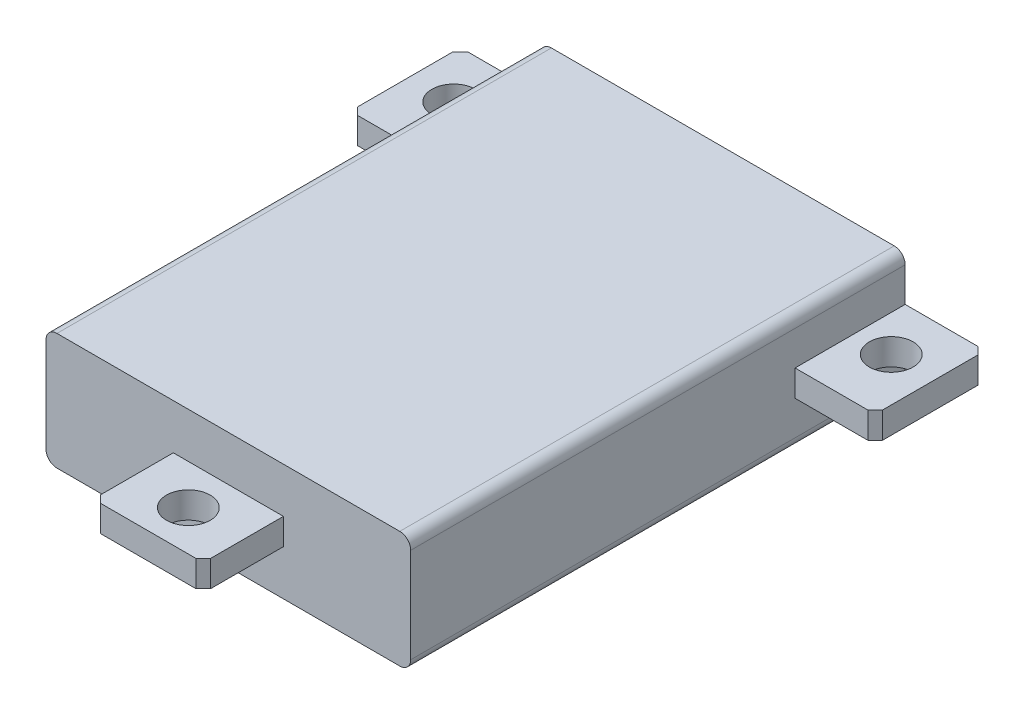
ISO-10303-21;
HEADER;
FILE_DESCRIPTION(('STEP AP214'),'2;1');
FILE_NAME('part.step','',(''),(''),'','','');
FILE_SCHEMA(('AUTOMOTIVE_DESIGN { 1 0 10303 214 1 1 1 1 }'));
ENDSEC;
DATA;
#1=APPLICATION_CONTEXT('core data for automotive mechanical design processes');
#2=APPLICATION_PROTOCOL_DEFINITION('international standard','automotive_design',2000,#1);
#3=PRODUCT_CONTEXT('',#1,'mechanical');
#4=PRODUCT('Part','Part','',(#3));
#5=PRODUCT_RELATED_PRODUCT_CATEGORY('part','',(#4));
#6=PRODUCT_DEFINITION_FORMATION('','',#4);
#7=PRODUCT_DEFINITION_CONTEXT('part definition',#1,'design');
#8=PRODUCT_DEFINITION('design','',#6,#7);
#9=PRODUCT_DEFINITION_SHAPE('','',#8);
#10=(LENGTH_UNIT() NAMED_UNIT(*) SI_UNIT(.MILLI.,.METRE.));
#11=(NAMED_UNIT(*) PLANE_ANGLE_UNIT() SI_UNIT($,.RADIAN.));
#12=(NAMED_UNIT(*) SI_UNIT($,.STERADIAN.) SOLID_ANGLE_UNIT());
#13=UNCERTAINTY_MEASURE_WITH_UNIT(LENGTH_MEASURE(1.E-05),#10,'distance_accuracy_value','');
#14=(GEOMETRIC_REPRESENTATION_CONTEXT(3) GLOBAL_UNCERTAINTY_ASSIGNED_CONTEXT((#13)) GLOBAL_UNIT_ASSIGNED_CONTEXT((#10,
#11,#12)) REPRESENTATION_CONTEXT('',''));
#15=CARTESIAN_POINT('',(0.,0.,0.));
#16=DIRECTION('',(0.,0.,1.));
#17=DIRECTION('',(1.,0.,0.));
#18=AXIS2_PLACEMENT_3D('',#15,#16,#17);
#19=CARTESIAN_POINT('',(-12.505,8.,16.9525));
#20=DIRECTION('',(1.,0.,0.));
#21=DIRECTION('',(0.,0.,-1.));
#22=AXIS2_PLACEMENT_3D('',#19,#20,#21);
#23=PLANE('',#22);
#24=DIRECTION('',(0.,-1.,0.));
#25=VECTOR('',#24,1.);
#26=CARTESIAN_POINT('',(-12.505,8.,-16.9525));
#27=LINE('',#26,#25);
#28=CARTESIAN_POINT('',(-12.505,3.1,-16.9525));
#29=VERTEX_POINT('',#28);
#30=CARTESIAN_POINT('',(-12.505,0.75,-16.9525));
#31=VERTEX_POINT('',#30);
#32=EDGE_CURVE('E350',#29,#31,#27,.T.);
#33=ORIENTED_EDGE('',*,*,#32,.T.);
#34=DIRECTION('',(0.,0.,1.));
#35=VECTOR('',#34,1.);
#36=CARTESIAN_POINT('',(-12.505,0.75,16.9525));
#37=LINE('',#36,#35);
#38=CARTESIAN_POINT('',(-12.505,0.75,16.9525));
#39=VERTEX_POINT('',#38);
#40=EDGE_CURVE('E416',#31,#39,#37,.T.);
#41=ORIENTED_EDGE('',*,*,#40,.T.);
#42=DIRECTION('',(0.,-1.,0.));
#43=VECTOR('',#42,1.);
#44=CARTESIAN_POINT('',(-12.505,8.,16.9525));
#45=LINE('',#44,#43);
#46=CARTESIAN_POINT('',(-12.505,7.25,16.9525));
#47=VERTEX_POINT('',#46);
#48=EDGE_CURVE('E346',#47,#39,#45,.T.);
#49=ORIENTED_EDGE('',*,*,#48,.F.);
#50=DIRECTION('',(0.,0.,1.));
#51=VECTOR('',#50,1.);
#52=CARTESIAN_POINT('',(-12.505,7.25,16.9525));
#53=LINE('',#52,#51);
#54=CARTESIAN_POINT('',(-12.505,7.25,-16.9525));
#55=VERTEX_POINT('',#54);
#56=EDGE_CURVE('E413',#47,#55,#53,.F.);
#57=ORIENTED_EDGE('',*,*,#56,.T.);
#58=CARTESIAN_POINT('',(-12.505,4.9,-16.9525));
#59=VERTEX_POINT('',#58);
#60=EDGE_CURVE('E351',#55,#59,#27,.T.);
#61=ORIENTED_EDGE('',*,*,#60,.T.);
#62=DIRECTION('',(0.,0.,-1.));
#63=VECTOR('',#62,1.);
#64=CARTESIAN_POINT('',(-12.505,4.9,-16.9525));
#65=LINE('',#64,#63);
#66=CARTESIAN_POINT('',(-12.505,4.9,-9.4025));
#67=VERTEX_POINT('',#66);
#68=EDGE_CURVE('E265',#67,#59,#65,.T.);
#69=ORIENTED_EDGE('',*,*,#68,.F.);
#70=DIRECTION('',(0.,1.,0.));
#71=VECTOR('',#70,1.);
#72=CARTESIAN_POINT('',(-12.505,3.1,-9.4025));
#73=LINE('',#72,#71);
#74=CARTESIAN_POINT('',(-12.505,3.1,-9.4025));
#75=VERTEX_POINT('',#74);
#76=EDGE_CURVE('E273',#75,#67,#73,.T.);
#77=ORIENTED_EDGE('',*,*,#76,.F.);
#78=DIRECTION('',(0.,0.,1.));
#79=VECTOR('',#78,1.);
#80=CARTESIAN_POINT('',(-12.505,3.1,-16.9525));
#81=LINE('',#80,#79);
#82=EDGE_CURVE('E259',#29,#75,#81,.T.);
#83=ORIENTED_EDGE('',*,*,#82,.F.);
#84=EDGE_LOOP('',(#33,#41,#49,#57,#61,#69,#77,#83));
#85=FACE_BOUND('',#84,.T.);
#86=ADVANCED_FACE('F40',(#85),#23,.F.);
#87=CARTESIAN_POINT('',(-12.505,8.,16.9525));
#88=DIRECTION('',(0.,0.,-1.));
#89=DIRECTION('',(-1.,0.,0.));
#90=AXIS2_PLACEMENT_3D('',#87,#88,#89);
#91=PLANE('',#90);
#92=DIRECTION('',(1.,0.,0.));
#93=VECTOR('',#92,1.);
#94=CARTESIAN_POINT('',(-12.505,0.,16.9525));
#95=LINE('',#94,#93);
#96=CARTESIAN_POINT('',(-11.755,0.,16.9525));
#97=VERTEX_POINT('',#96);
#98=CARTESIAN_POINT('',(11.755,0.,16.9525));
#99=VERTEX_POINT('',#98);
#100=EDGE_CURVE('E333',#97,#99,#95,.T.);
#101=ORIENTED_EDGE('',*,*,#100,.T.);
#102=CARTESIAN_POINT('',(11.755,0.75,16.9525));
#103=DIRECTION('',(0.,0.,-1.));
#104=DIRECTION('',(-1.,0.,0.));
#105=AXIS2_PLACEMENT_3D('',#102,#103,#104);
#106=CIRCLE('',#105,0.75);
#107=CARTESIAN_POINT('',(12.505,0.75,16.9525));
#108=VERTEX_POINT('',#107);
#109=EDGE_CURVE('E402',#99,#108,#106,.F.);
#110=ORIENTED_EDGE('',*,*,#109,.T.);
#111=DIRECTION('',(0.,-1.,0.));
#112=VECTOR('',#111,1.);
#113=CARTESIAN_POINT('',(12.505,8.,16.9525));
#114=LINE('',#113,#112);
#115=CARTESIAN_POINT('',(12.505,7.25,16.9525));
#116=VERTEX_POINT('',#115);
#117=EDGE_CURVE('E337',#116,#108,#114,.T.);
#118=ORIENTED_EDGE('',*,*,#117,.F.);
#119=CARTESIAN_POINT('',(11.755,7.25,16.9525));
#120=DIRECTION('',(0.,0.,-1.));
#121=DIRECTION('',(-1.,0.,0.));
#122=AXIS2_PLACEMENT_3D('',#119,#120,#121);
#123=CIRCLE('',#122,0.75);
#124=CARTESIAN_POINT('',(11.755,8.,16.9525));
#125=VERTEX_POINT('',#124);
#126=EDGE_CURVE('E399',#116,#125,#123,.F.);
#127=ORIENTED_EDGE('',*,*,#126,.T.);
#128=DIRECTION('',(1.,0.,0.));
#129=VECTOR('',#128,1.);
#130=CARTESIAN_POINT('',(-12.505,8.,16.9525));
#131=LINE('',#130,#129);
#132=CARTESIAN_POINT('',(-11.755,8.,16.9525));
#133=VERTEX_POINT('',#132);
#134=EDGE_CURVE('E332',#133,#125,#131,.T.);
#135=ORIENTED_EDGE('',*,*,#134,.F.);
#136=CARTESIAN_POINT('',(-11.755,7.25,16.9525));
#137=DIRECTION('',(0.,0.,-1.));
#138=DIRECTION('',(-1.,0.,0.));
#139=AXIS2_PLACEMENT_3D('',#136,#137,#138);
#140=CIRCLE('',#139,0.75);
#141=EDGE_CURVE('E393',#133,#47,#140,.F.);
#142=ORIENTED_EDGE('',*,*,#141,.T.);
#143=ORIENTED_EDGE('',*,*,#48,.T.);
#144=CARTESIAN_POINT('',(-11.755,0.75,16.9525));
#145=DIRECTION('',(0.,0.,-1.));
#146=DIRECTION('',(-1.,0.,0.));
#147=AXIS2_PLACEMENT_3D('',#144,#145,#146);
#148=CIRCLE('',#147,0.75);
#149=EDGE_CURVE('E396',#39,#97,#148,.F.);
#150=ORIENTED_EDGE('',*,*,#149,.T.);
#151=EDGE_LOOP('',(#101,#110,#118,#127,#135,#142,#143,#150));
#152=FACE_BOUND('',#151,.T.);
#153=DIRECTION('',(0.,1.,0.));
#154=VECTOR('',#153,1.);
#155=CARTESIAN_POINT('',(3.775,3.1,16.9525));
#156=LINE('',#155,#154);
#157=CARTESIAN_POINT('',(3.775,3.1,16.9525));
#158=VERTEX_POINT('',#157);
#159=CARTESIAN_POINT('',(3.775,4.9,16.9525));
#160=VERTEX_POINT('',#159);
#161=EDGE_CURVE('E291',#158,#160,#156,.T.);
#162=ORIENTED_EDGE('',*,*,#161,.F.);
#163=DIRECTION('',(1.,0.,0.));
#164=VECTOR('',#163,1.);
#165=CARTESIAN_POINT('',(-3.775,3.1,16.9525));
#166=LINE('',#165,#164);
#167=CARTESIAN_POINT('',(-3.775,3.1,16.9525));
#168=VERTEX_POINT('',#167);
#169=EDGE_CURVE('E297',#168,#158,#166,.T.);
#170=ORIENTED_EDGE('',*,*,#169,.F.);
#171=DIRECTION('',(0.,-1.,0.));
#172=VECTOR('',#171,1.);
#173=CARTESIAN_POINT('',(-3.775,3.1,16.9525));
#174=LINE('',#173,#172);
#175=CARTESIAN_POINT('',(-3.775,4.9,16.9525));
#176=VERTEX_POINT('',#175);
#177=EDGE_CURVE('E309',#176,#168,#174,.T.);
#178=ORIENTED_EDGE('',*,*,#177,.F.);
#179=DIRECTION('',(-1.,0.,0.));
#180=VECTOR('',#179,1.);
#181=CARTESIAN_POINT('',(-3.775,4.9,16.9525));
#182=LINE('',#181,#180);
#183=EDGE_CURVE('E305',#160,#176,#182,.T.);
#184=ORIENTED_EDGE('',*,*,#183,.F.);
#185=EDGE_LOOP('',(#162,#170,#178,#184));
#186=FACE_BOUND('',#185,.T.);
#187=ADVANCED_FACE('F578',(#152,#186),#91,.F.);
#188=CARTESIAN_POINT('',(12.505,8.,16.9525));
#189=DIRECTION('',(-1.,0.,0.));
#190=DIRECTION('',(0.,0.,1.));
#191=AXIS2_PLACEMENT_3D('',#188,#189,#190);
#192=PLANE('',#191);
#193=ORIENTED_EDGE('',*,*,#117,.T.);
#194=DIRECTION('',(0.,0.,-1.));
#195=VECTOR('',#194,1.);
#196=CARTESIAN_POINT('',(12.505,0.75,-16.9525));
#197=LINE('',#196,#195);
#198=CARTESIAN_POINT('',(12.505,0.75,-16.9525));
#199=VERTEX_POINT('',#198);
#200=EDGE_CURVE('E371',#108,#199,#197,.T.);
#201=ORIENTED_EDGE('',*,*,#200,.T.);
#202=DIRECTION('',(0.,-1.,0.));
#203=VECTOR('',#202,1.);
#204=CARTESIAN_POINT('',(12.505,8.,-16.9525));
#205=LINE('',#204,#203);
#206=CARTESIAN_POINT('',(12.505,3.1,-16.9525));
#207=VERTEX_POINT('',#206);
#208=EDGE_CURVE('E355',#207,#199,#205,.T.);
#209=ORIENTED_EDGE('',*,*,#208,.F.);
#210=DIRECTION('',(0.,0.,1.));
#211=VECTOR('',#210,1.);
#212=CARTESIAN_POINT('',(12.505,3.1,-16.9525));
#213=LINE('',#212,#211);
#214=CARTESIAN_POINT('',(12.505,3.1,-9.4025));
#215=VERTEX_POINT('',#214);
#216=EDGE_CURVE('E243',#207,#215,#213,.T.);
#217=ORIENTED_EDGE('',*,*,#216,.T.);
#218=DIRECTION('',(0.,1.,0.));
#219=VECTOR('',#218,1.);
#220=CARTESIAN_POINT('',(12.505,3.1,-9.4025));
#221=LINE('',#220,#219);
#222=CARTESIAN_POINT('',(12.505,4.9,-9.4025));
#223=VERTEX_POINT('',#222);
#224=EDGE_CURVE('E220',#215,#223,#221,.T.);
#225=ORIENTED_EDGE('',*,*,#224,.T.);
#226=DIRECTION('',(0.,0.,-1.));
#227=VECTOR('',#226,1.);
#228=CARTESIAN_POINT('',(12.505,4.9,-16.9525));
#229=LINE('',#228,#227);
#230=CARTESIAN_POINT('',(12.505,4.9,-16.9525));
#231=VERTEX_POINT('',#230);
#232=EDGE_CURVE('E230',#223,#231,#229,.T.);
#233=ORIENTED_EDGE('',*,*,#232,.T.);
#234=CARTESIAN_POINT('',(12.505,7.25,-16.9525));
#235=VERTEX_POINT('',#234);
#236=EDGE_CURVE('E356',#235,#231,#205,.T.);
#237=ORIENTED_EDGE('',*,*,#236,.F.);
#238=DIRECTION('',(0.,0.,-1.));
#239=VECTOR('',#238,1.);
#240=CARTESIAN_POINT('',(12.505,7.25,16.9525));
#241=LINE('',#240,#239);
#242=EDGE_CURVE('E359',#235,#116,#241,.F.);
#243=ORIENTED_EDGE('',*,*,#242,.T.);
#244=EDGE_LOOP('',(#193,#201,#209,#217,#225,#233,#237,#243));
#245=FACE_BOUND('',#244,.T.);
#246=ADVANCED_FACE('F240',(#245),#192,.F.);
#247=CARTESIAN_POINT('',(-12.505,8.,-16.9525));
#248=DIRECTION('',(0.,0.,1.));
#249=DIRECTION('',(1.,0.,0.));
#250=AXIS2_PLACEMENT_3D('',#247,#248,#249);
#251=PLANE('',#250);
#252=CARTESIAN_POINT('',(6.555,4.,-16.9525));
#253=DIRECTION('',(0.,0.,-1.));
#254=DIRECTION('',(-1.,0.,0.));
#255=AXIS2_PLACEMENT_3D('',#252,#253,#254);
#256=CIRCLE('',#255,1.5);
#257=CARTESIAN_POINT('',(5.055,4.,-16.9525));
#258=VERTEX_POINT('',#257);
#259=EDGE_CURVE('E514',#258,#258,#256,.T.);
#260=ORIENTED_EDGE('',*,*,#259,.F.);
#261=EDGE_LOOP('',(#260));
#262=FACE_BOUND('',#261,.T.);
#263=DIRECTION('',(1.,0.,0.));
#264=VECTOR('',#263,1.);
#265=CARTESIAN_POINT('',(-18.,3.1,-16.9525));
#266=LINE('',#265,#264);
#267=CARTESIAN_POINT('',(-17.5,3.1,-16.9525));
#268=VERTEX_POINT('',#267);
#269=EDGE_CURVE('E288',#268,#29,#266,.T.);
#270=ORIENTED_EDGE('',*,*,#269,.F.);
#271=DIRECTION('',(0.,1.,0.));
#272=VECTOR('',#271,1.);
#273=CARTESIAN_POINT('',(-17.5,8.,-16.9525));
#274=LINE('',#273,#272);
#275=CARTESIAN_POINT('',(-17.5,4.9,-16.9525));
#276=VERTEX_POINT('',#275);
#277=EDGE_CURVE('E438',#268,#276,#274,.T.);
#278=ORIENTED_EDGE('',*,*,#277,.T.);
#279=DIRECTION('',(1.,0.,0.));
#280=VECTOR('',#279,1.);
#281=CARTESIAN_POINT('',(-18.,4.9,-16.9525));
#282=LINE('',#281,#280);
#283=EDGE_CURVE('E269',#276,#59,#282,.T.);
#284=ORIENTED_EDGE('',*,*,#283,.T.);
#285=ORIENTED_EDGE('',*,*,#60,.F.);
#286=CARTESIAN_POINT('',(-11.755,7.25,-16.9525));
#287=DIRECTION('',(0.,0.,1.));
#288=DIRECTION('',(1.,0.,0.));
#289=AXIS2_PLACEMENT_3D('',#286,#287,#288);
#290=CIRCLE('',#289,0.75);
#291=CARTESIAN_POINT('',(-11.755,8.,-16.9525));
#292=VERTEX_POINT('',#291);
#293=EDGE_CURVE('E375',#55,#292,#290,.F.);
#294=ORIENTED_EDGE('',*,*,#293,.T.);
#295=DIRECTION('',(-1.,0.,0.));
#296=VECTOR('',#295,1.);
#297=CARTESIAN_POINT('',(-12.505,8.,-16.9525));
#298=LINE('',#297,#296);
#299=CARTESIAN_POINT('',(11.755,8.,-16.9525));
#300=VERTEX_POINT('',#299);
#301=EDGE_CURVE('E328',#300,#292,#298,.T.);
#302=ORIENTED_EDGE('',*,*,#301,.F.);
#303=CARTESIAN_POINT('',(11.755,7.25,-16.9525));
#304=DIRECTION('',(0.,0.,1.));
#305=DIRECTION('',(1.,0.,0.));
#306=AXIS2_PLACEMENT_3D('',#303,#304,#305);
#307=CIRCLE('',#306,0.75);
#308=EDGE_CURVE('E381',#300,#235,#307,.F.);
#309=ORIENTED_EDGE('',*,*,#308,.T.);
#310=ORIENTED_EDGE('',*,*,#236,.T.);
#311=DIRECTION('',(-1.,0.,0.));
#312=VECTOR('',#311,1.);
#313=CARTESIAN_POINT('',(18.,4.9,-16.9525));
#314=LINE('',#313,#312);
#315=CARTESIAN_POINT('',(17.5,4.9,-16.9525));
#316=VERTEX_POINT('',#315);
#317=EDGE_CURVE('E226',#316,#231,#314,.T.);
#318=ORIENTED_EDGE('',*,*,#317,.F.);
#319=DIRECTION('',(0.,-1.,0.));
#320=VECTOR('',#319,1.);
#321=CARTESIAN_POINT('',(17.5,8.,-16.9525));
#322=LINE('',#321,#320);
#323=CARTESIAN_POINT('',(17.5,3.1,-16.9525));
#324=VERTEX_POINT('',#323);
#325=EDGE_CURVE('E434',#316,#324,#322,.T.);
#326=ORIENTED_EDGE('',*,*,#325,.T.);
#327=DIRECTION('',(-1.,0.,0.));
#328=VECTOR('',#327,1.);
#329=CARTESIAN_POINT('',(18.,3.1,-16.9525));
#330=LINE('',#329,#328);
#331=EDGE_CURVE('E251',#324,#207,#330,.T.);
#332=ORIENTED_EDGE('',*,*,#331,.T.);
#333=ORIENTED_EDGE('',*,*,#208,.T.);
#334=CARTESIAN_POINT('',(11.755,0.75,-16.9525));
#335=DIRECTION('',(0.,0.,1.));
#336=DIRECTION('',(1.,0.,0.));
#337=AXIS2_PLACEMENT_3D('',#334,#335,#336);
#338=CIRCLE('',#337,0.75);
#339=CARTESIAN_POINT('',(11.755,0.,-16.9525));
#340=VERTEX_POINT('',#339);
#341=EDGE_CURVE('E384',#199,#340,#338,.F.);
#342=ORIENTED_EDGE('',*,*,#341,.T.);
#343=DIRECTION('',(-1.,0.,0.));
#344=VECTOR('',#343,1.);
#345=CARTESIAN_POINT('',(-12.505,0.,-16.9525));
#346=LINE('',#345,#344);
#347=CARTESIAN_POINT('',(-11.755,0.,-16.9525));
#348=VERTEX_POINT('',#347);
#349=EDGE_CURVE('E327',#340,#348,#346,.T.);
#350=ORIENTED_EDGE('',*,*,#349,.T.);
#351=CARTESIAN_POINT('',(-11.755,0.75,-16.9525));
#352=DIRECTION('',(0.,0.,1.));
#353=DIRECTION('',(1.,0.,0.));
#354=AXIS2_PLACEMENT_3D('',#351,#352,#353);
#355=CIRCLE('',#354,0.75);
#356=EDGE_CURVE('E378',#348,#31,#355,.F.);
#357=ORIENTED_EDGE('',*,*,#356,.T.);
#358=ORIENTED_EDGE('',*,*,#32,.F.);
#359=EDGE_LOOP('',(#270,#278,#284,#285,#294,#302,#309,#310,#318,#326,#332,#333,#342,#350,#357,#358));
#360=FACE_BOUND('',#359,.T.);
#361=ADVANCED_FACE('F531',(#262,#360),#251,.F.);
#362=CARTESIAN_POINT('',(0.,8.,0.));
#363=DIRECTION('',(0.,-1.,0.));
#364=DIRECTION('',(0.,0.,-1.));
#365=AXIS2_PLACEMENT_3D('',#362,#363,#364);
#366=PLANE('',#365);
#367=ORIENTED_EDGE('',*,*,#134,.T.);
#368=DIRECTION('',(0.,0.,-1.));
#369=VECTOR('',#368,1.);
#370=CARTESIAN_POINT('',(11.755,8.,0.));
#371=LINE('',#370,#369);
#372=EDGE_CURVE('E409',#125,#300,#371,.T.);
#373=ORIENTED_EDGE('',*,*,#372,.T.);
#374=ORIENTED_EDGE('',*,*,#301,.T.);
#375=DIRECTION('',(0.,0.,1.));
#376=VECTOR('',#375,1.);
#377=CARTESIAN_POINT('',(-11.755,8.,0.));
#378=LINE('',#377,#376);
#379=EDGE_CURVE('E405',#292,#133,#378,.T.);
#380=ORIENTED_EDGE('',*,*,#379,.T.);
#381=EDGE_LOOP('',(#367,#373,#374,#380));
#382=FACE_BOUND('',#381,.T.);
#383=ADVANCED_FACE('F534',(#382),#366,.F.);
#384=CARTESIAN_POINT('',(0.,0.,0.));
#385=DIRECTION('',(0.,-1.,0.));
#386=DIRECTION('',(0.,0.,-1.));
#387=AXIS2_PLACEMENT_3D('',#384,#385,#386);
#388=PLANE('',#387);
#389=ORIENTED_EDGE('',*,*,#349,.F.);
#390=DIRECTION('',(0.,0.,-1.));
#391=VECTOR('',#390,1.);
#392=CARTESIAN_POINT('',(11.755,0.,16.9525));
#393=LINE('',#392,#391);
#394=EDGE_CURVE('E390',#340,#99,#393,.F.);
#395=ORIENTED_EDGE('',*,*,#394,.T.);
#396=ORIENTED_EDGE('',*,*,#100,.F.);
#397=DIRECTION('',(0.,0.,1.));
#398=VECTOR('',#397,1.);
#399=CARTESIAN_POINT('',(-11.755,0.,-16.9525));
#400=LINE('',#399,#398);
#401=EDGE_CURVE('E387',#97,#348,#400,.F.);
#402=ORIENTED_EDGE('',*,*,#401,.T.);
#403=EDGE_LOOP('',(#389,#395,#396,#402));
#404=FACE_BOUND('',#403,.T.);
#405=ADVANCED_FACE('F664',(#404),#388,.T.);
#406=CARTESIAN_POINT('',(3.775,3.1,22.4475));
#407=DIRECTION('',(-1.,0.,0.));
#408=DIRECTION('',(0.,0.,1.));
#409=AXIS2_PLACEMENT_3D('',#406,#407,#408);
#410=PLANE('',#409);
#411=DIRECTION('',(0.,0.,-1.));
#412=VECTOR('',#411,1.);
#413=CARTESIAN_POINT('',(3.775,4.9,22.4475));
#414=LINE('',#413,#412);
#415=CARTESIAN_POINT('',(3.775,4.9,21.9475));
#416=VERTEX_POINT('',#415);
#417=EDGE_CURVE('E324',#416,#160,#414,.T.);
#418=ORIENTED_EDGE('',*,*,#417,.F.);
#419=DIRECTION('',(0.,-1.,0.));
#420=VECTOR('',#419,1.);
#421=CARTESIAN_POINT('',(3.775,3.1,21.9475));
#422=LINE('',#421,#420);
#423=CARTESIAN_POINT('',(3.775,3.1,21.9475));
#424=VERTEX_POINT('',#423);
#425=EDGE_CURVE('E473',#416,#424,#422,.T.);
#426=ORIENTED_EDGE('',*,*,#425,.T.);
#427=DIRECTION('',(0.,0.,-1.));
#428=VECTOR('',#427,1.);
#429=CARTESIAN_POINT('',(3.775,3.1,22.4475));
#430=LINE('',#429,#428);
#431=EDGE_CURVE('E301',#424,#158,#430,.T.);
#432=ORIENTED_EDGE('',*,*,#431,.T.);
#433=ORIENTED_EDGE('',*,*,#161,.T.);
#434=EDGE_LOOP('',(#418,#426,#432,#433));
#435=FACE_BOUND('',#434,.T.);
#436=ADVANCED_FACE('F668',(#435),#410,.F.);
#437=CARTESIAN_POINT('',(-3.775,4.9,22.4475));
#438=DIRECTION('',(0.,-1.,0.));
#439=DIRECTION('',(0.,0.,-1.));
#440=AXIS2_PLACEMENT_3D('',#437,#438,#439);
#441=PLANE('',#440);
#442=CARTESIAN_POINT('',(0.,4.9,19.6975));
#443=DIRECTION('',(0.,1.,0.));
#444=DIRECTION('',(0.,0.,1.));
#445=AXIS2_PLACEMENT_3D('',#442,#443,#444);
#446=CIRCLE('',#445,1.5);
#447=CARTESIAN_POINT('',(0.,4.9,21.1975));
#448=VERTEX_POINT('',#447);
#449=EDGE_CURVE('E502',#448,#448,#446,.T.);
#450=ORIENTED_EDGE('',*,*,#449,.F.);
#451=EDGE_LOOP('',(#450));
#452=FACE_BOUND('',#451,.T.);
#453=DIRECTION('',(0.,0.,-1.));
#454=VECTOR('',#453,1.);
#455=CARTESIAN_POINT('',(-3.775,4.9,22.4475));
#456=LINE('',#455,#454);
#457=CARTESIAN_POINT('',(-3.775,4.9,21.9475));
#458=VERTEX_POINT('',#457);
#459=EDGE_CURVE('E321',#458,#176,#456,.T.);
#460=ORIENTED_EDGE('',*,*,#459,.F.);
#461=DIRECTION('',(-0.707106781186548,0.,-0.707106781186548));
#462=VECTOR('',#461,1.);
#463=CARTESIAN_POINT('',(-3.275,4.9,22.4475));
#464=LINE('',#463,#462);
#465=CARTESIAN_POINT('',(-3.275,4.9,22.4475));
#466=VERTEX_POINT('',#465);
#467=EDGE_CURVE('E470',#458,#466,#464,.F.);
#468=ORIENTED_EDGE('',*,*,#467,.T.);
#469=DIRECTION('',(-1.,0.,0.));
#470=VECTOR('',#469,1.);
#471=CARTESIAN_POINT('',(-3.775,4.9,22.4475));
#472=LINE('',#471,#470);
#473=CARTESIAN_POINT('',(3.275,4.9,22.4475));
#474=VERTEX_POINT('',#473);
#475=EDGE_CURVE('E292',#474,#466,#472,.T.);
#476=ORIENTED_EDGE('',*,*,#475,.F.);
#477=DIRECTION('',(-0.707106781186548,0.,0.707106781186548));
#478=VECTOR('',#477,1.);
#479=CARTESIAN_POINT('',(3.275,4.9,22.4475));
#480=LINE('',#479,#478);
#481=EDGE_CURVE('E467',#474,#416,#480,.F.);
#482=ORIENTED_EDGE('',*,*,#481,.T.);
#483=ORIENTED_EDGE('',*,*,#417,.T.);
#484=ORIENTED_EDGE('',*,*,#183,.T.);
#485=EDGE_LOOP('',(#460,#468,#476,#482,#483,#484));
#486=FACE_BOUND('',#485,.T.);
#487=ADVANCED_FACE('F674',(#452,#486),#441,.F.);
#488=CARTESIAN_POINT('',(-3.775,3.1,22.4475));
#489=DIRECTION('',(1.,0.,0.));
#490=DIRECTION('',(0.,0.,-1.));
#491=AXIS2_PLACEMENT_3D('',#488,#489,#490);
#492=PLANE('',#491);
#493=DIRECTION('',(0.,0.,-1.));
#494=VECTOR('',#493,1.);
#495=CARTESIAN_POINT('',(-3.775,3.1,22.4475));
#496=LINE('',#495,#494);
#497=CARTESIAN_POINT('',(-3.775,3.1,21.9475));
#498=VERTEX_POINT('',#497);
#499=EDGE_CURVE('E318',#498,#168,#496,.T.);
#500=ORIENTED_EDGE('',*,*,#499,.F.);
#501=DIRECTION('',(0.,1.,0.));
#502=VECTOR('',#501,1.);
#503=CARTESIAN_POINT('',(-3.775,3.1,21.9475));
#504=LINE('',#503,#502);
#505=EDGE_CURVE('E464',#498,#458,#504,.T.);
#506=ORIENTED_EDGE('',*,*,#505,.T.);
#507=ORIENTED_EDGE('',*,*,#459,.T.);
#508=ORIENTED_EDGE('',*,*,#177,.T.);
#509=EDGE_LOOP('',(#500,#506,#507,#508));
#510=FACE_BOUND('',#509,.T.);
#511=ADVANCED_FACE('F681',(#510),#492,.F.);
#512=CARTESIAN_POINT('',(-3.775,3.1,22.4475));
#513=DIRECTION('',(0.,1.,0.));
#514=DIRECTION('',(0.,0.,1.));
#515=AXIS2_PLACEMENT_3D('',#512,#513,#514);
#516=PLANE('',#515);
#517=CARTESIAN_POINT('',(0.,3.1,19.6975));
#518=DIRECTION('',(0.,1.,0.));
#519=DIRECTION('',(0.,0.,1.));
#520=AXIS2_PLACEMENT_3D('',#517,#518,#519);
#521=CIRCLE('',#520,1.5);
#522=CARTESIAN_POINT('',(0.,3.1,21.1975));
#523=VERTEX_POINT('',#522);
#524=EDGE_CURVE('E237',#523,#523,#521,.T.);
#525=ORIENTED_EDGE('',*,*,#524,.T.);
#526=EDGE_LOOP('',(#525));
#527=FACE_BOUND('',#526,.T.);
#528=DIRECTION('',(1.,0.,0.));
#529=VECTOR('',#528,1.);
#530=CARTESIAN_POINT('',(-3.775,3.1,22.4475));
#531=LINE('',#530,#529);
#532=CARTESIAN_POINT('',(-3.275,3.1,22.4475));
#533=VERTEX_POINT('',#532);
#534=CARTESIAN_POINT('',(3.275,3.1,22.4475));
#535=VERTEX_POINT('',#534);
#536=EDGE_CURVE('E296',#533,#535,#531,.T.);
#537=ORIENTED_EDGE('',*,*,#536,.F.);
#538=DIRECTION('',(0.707106781186548,0.,0.707106781186548));
#539=VECTOR('',#538,1.);
#540=CARTESIAN_POINT('',(-3.275,3.1,22.4475));
#541=LINE('',#540,#539);
#542=EDGE_CURVE('E461',#533,#498,#541,.F.);
#543=ORIENTED_EDGE('',*,*,#542,.T.);
#544=ORIENTED_EDGE('',*,*,#499,.T.);
#545=ORIENTED_EDGE('',*,*,#169,.T.);
#546=ORIENTED_EDGE('',*,*,#431,.F.);
#547=DIRECTION('',(0.707106781186548,0.,-0.707106781186548));
#548=VECTOR('',#547,1.);
#549=CARTESIAN_POINT('',(3.275,3.1,22.4475));
#550=LINE('',#549,#548);
#551=EDGE_CURVE('E458',#424,#535,#550,.F.);
#552=ORIENTED_EDGE('',*,*,#551,.T.);
#553=EDGE_LOOP('',(#537,#543,#544,#545,#546,#552));
#554=FACE_BOUND('',#553,.T.);
#555=ADVANCED_FACE('F574',(#527,#554),#516,.F.);
#556=CARTESIAN_POINT('',(0.,0.,22.4475));
#557=DIRECTION('',(0.,0.,-1.));
#558=DIRECTION('',(-1.,0.,0.));
#559=AXIS2_PLACEMENT_3D('',#556,#557,#558);
#560=PLANE('',#559);
#561=ORIENTED_EDGE('',*,*,#475,.T.);
#562=DIRECTION('',(0.,-1.,0.));
#563=VECTOR('',#562,1.);
#564=CARTESIAN_POINT('',(-3.275,0.,22.4475));
#565=LINE('',#564,#563);
#566=EDGE_CURVE('E454',#466,#533,#565,.T.);
#567=ORIENTED_EDGE('',*,*,#566,.T.);
#568=ORIENTED_EDGE('',*,*,#536,.T.);
#569=DIRECTION('',(0.,1.,0.));
#570=VECTOR('',#569,1.);
#571=CARTESIAN_POINT('',(3.275,0.,22.4475));
#572=LINE('',#571,#570);
#573=EDGE_CURVE('E450',#535,#474,#572,.T.);
#574=ORIENTED_EDGE('',*,*,#573,.T.);
#575=EDGE_LOOP('',(#561,#567,#568,#574));
#576=FACE_BOUND('',#575,.T.);
#577=ADVANCED_FACE('F566',(#576),#560,.F.);
#578=CARTESIAN_POINT('',(-18.,3.1,-16.9525));
#579=DIRECTION('',(0.,1.,0.));
#580=DIRECTION('',(0.,0.,1.));
#581=AXIS2_PLACEMENT_3D('',#578,#579,#580);
#582=PLANE('',#581);
#583=CARTESIAN_POINT('',(-15.,3.1,-13.5025));
#584=DIRECTION('',(0.,1.,0.));
#585=DIRECTION('',(0.,0.,1.));
#586=AXIS2_PLACEMENT_3D('',#583,#584,#585);
#587=CIRCLE('',#586,1.5);
#588=CARTESIAN_POINT('',(-15.,3.1,-12.0025));
#589=VERTEX_POINT('',#588);
#590=EDGE_CURVE('E364',#589,#589,#587,.T.);
#591=ORIENTED_EDGE('',*,*,#590,.T.);
#592=EDGE_LOOP('',(#591));
#593=FACE_BOUND('',#592,.T.);
#594=DIRECTION('',(0.,0.,1.));
#595=VECTOR('',#594,1.);
#596=CARTESIAN_POINT('',(-18.,3.1,-16.9525));
#597=LINE('',#596,#595);
#598=CARTESIAN_POINT('',(-18.,3.1,-16.4525));
#599=VERTEX_POINT('',#598);
#600=CARTESIAN_POINT('',(-18.,3.1,-9.9025));
#601=VERTEX_POINT('',#600);
#602=EDGE_CURVE('E260',#599,#601,#597,.T.);
#603=ORIENTED_EDGE('',*,*,#602,.F.);
#604=DIRECTION('',(-0.707106781186552,0.,0.707106781186543));
#605=VECTOR('',#604,1.);
#606=CARTESIAN_POINT('',(-18.,3.1,-16.4525));
#607=LINE('',#606,#605);
#608=EDGE_CURVE('E431',#599,#268,#607,.F.);
#609=ORIENTED_EDGE('',*,*,#608,.T.);
#610=ORIENTED_EDGE('',*,*,#269,.T.);
#611=ORIENTED_EDGE('',*,*,#82,.T.);
#612=DIRECTION('',(1.,0.,0.));
#613=VECTOR('',#612,1.);
#614=CARTESIAN_POINT('',(-18.,3.1,-9.4025));
#615=LINE('',#614,#613);
#616=CARTESIAN_POINT('',(-17.5,3.1,-9.4025));
#617=VERTEX_POINT('',#616);
#618=EDGE_CURVE('E285',#617,#75,#615,.T.);
#619=ORIENTED_EDGE('',*,*,#618,.F.);
#620=DIRECTION('',(0.707106781186548,0.,0.707106781186548));
#621=VECTOR('',#620,1.);
#622=CARTESIAN_POINT('',(-18.,3.1,-9.9025));
#623=LINE('',#622,#621);
#624=EDGE_CURVE('E428',#617,#601,#623,.F.);
#625=ORIENTED_EDGE('',*,*,#624,.T.);
#626=EDGE_LOOP('',(#603,#609,#610,#611,#619,#625));
#627=FACE_BOUND('',#626,.T.);
#628=ADVANCED_FACE('F564',(#593,#627),#582,.F.);
#629=CARTESIAN_POINT('',(-18.,3.1,-9.4025));
#630=DIRECTION('',(0.,0.,-1.));
#631=DIRECTION('',(-1.,0.,0.));
#632=AXIS2_PLACEMENT_3D('',#629,#630,#631);
#633=PLANE('',#632);
#634=DIRECTION('',(1.,0.,0.));
#635=VECTOR('',#634,1.);
#636=CARTESIAN_POINT('',(-18.,4.9,-9.4025));
#637=LINE('',#636,#635);
#638=CARTESIAN_POINT('',(-17.5,4.9,-9.4025));
#639=VERTEX_POINT('',#638);
#640=EDGE_CURVE('E282',#639,#67,#637,.T.);
#641=ORIENTED_EDGE('',*,*,#640,.F.);
#642=DIRECTION('',(0.,-1.,0.));
#643=VECTOR('',#642,1.);
#644=CARTESIAN_POINT('',(-17.5,3.1,-9.4025));
#645=LINE('',#644,#643);
#646=EDGE_CURVE('E447',#639,#617,#645,.T.);
#647=ORIENTED_EDGE('',*,*,#646,.T.);
#648=ORIENTED_EDGE('',*,*,#618,.T.);
#649=ORIENTED_EDGE('',*,*,#76,.T.);
#650=EDGE_LOOP('',(#641,#647,#648,#649));
#651=FACE_BOUND('',#650,.T.);
#652=ADVANCED_FACE('F560',(#651),#633,.F.);
#653=CARTESIAN_POINT('',(-18.,4.9,-16.9525));
#654=DIRECTION('',(0.,-1.,0.));
#655=DIRECTION('',(0.,0.,-1.));
#656=AXIS2_PLACEMENT_3D('',#653,#654,#655);
#657=PLANE('',#656);
#658=CARTESIAN_POINT('',(-15.,4.9,-13.5025));
#659=DIRECTION('',(0.,1.,0.));
#660=DIRECTION('',(0.,0.,1.));
#661=AXIS2_PLACEMENT_3D('',#658,#659,#660);
#662=CIRCLE('',#661,1.5);
#663=CARTESIAN_POINT('',(-15.,4.9,-12.0025));
#664=VERTEX_POINT('',#663);
#665=EDGE_CURVE('E365',#664,#664,#662,.T.);
#666=ORIENTED_EDGE('',*,*,#665,.F.);
#667=EDGE_LOOP('',(#666));
#668=FACE_BOUND('',#667,.T.);
#669=ORIENTED_EDGE('',*,*,#283,.F.);
#670=DIRECTION('',(0.707106781186552,0.,-0.707106781186543));
#671=VECTOR('',#670,1.);
#672=CARTESIAN_POINT('',(-18.,4.9,-16.4525));
#673=LINE('',#672,#671);
#674=CARTESIAN_POINT('',(-18.,4.9,-16.4525));
#675=VERTEX_POINT('',#674);
#676=EDGE_CURVE('E444',#276,#675,#673,.F.);
#677=ORIENTED_EDGE('',*,*,#676,.T.);
#678=DIRECTION('',(0.,0.,-1.));
#679=VECTOR('',#678,1.);
#680=CARTESIAN_POINT('',(-18.,4.9,-16.9525));
#681=LINE('',#680,#679);
#682=CARTESIAN_POINT('',(-18.,4.9,-9.9025));
#683=VERTEX_POINT('',#682);
#684=EDGE_CURVE('E264',#683,#675,#681,.T.);
#685=ORIENTED_EDGE('',*,*,#684,.F.);
#686=DIRECTION('',(-0.707106781186548,0.,-0.707106781186548));
#687=VECTOR('',#686,1.);
#688=CARTESIAN_POINT('',(-18.,4.9,-9.9025));
#689=LINE('',#688,#687);
#690=EDGE_CURVE('E441',#683,#639,#689,.F.);
#691=ORIENTED_EDGE('',*,*,#690,.T.);
#692=ORIENTED_EDGE('',*,*,#640,.T.);
#693=ORIENTED_EDGE('',*,*,#68,.T.);
#694=EDGE_LOOP('',(#669,#677,#685,#691,#692,#693));
#695=FACE_BOUND('',#694,.T.);
#696=ADVANCED_FACE('F548',(#668,#695),#657,.F.);
#697=CARTESIAN_POINT('',(-18.,0.,0.));
#698=DIRECTION('',(1.,0.,0.));
#699=DIRECTION('',(0.,0.,-1.));
#700=AXIS2_PLACEMENT_3D('',#697,#698,#699);
#701=PLANE('',#700);
#702=ORIENTED_EDGE('',*,*,#684,.T.);
#703=DIRECTION('',(0.,-1.,0.));
#704=VECTOR('',#703,1.);
#705=CARTESIAN_POINT('',(-18.,0.,-16.4525));
#706=LINE('',#705,#704);
#707=EDGE_CURVE('E424',#675,#599,#706,.T.);
#708=ORIENTED_EDGE('',*,*,#707,.T.);
#709=ORIENTED_EDGE('',*,*,#602,.T.);
#710=DIRECTION('',(0.,1.,0.));
#711=VECTOR('',#710,1.);
#712=CARTESIAN_POINT('',(-18.,0.,-9.9025));
#713=LINE('',#712,#711);
#714=EDGE_CURVE('E420',#601,#683,#713,.T.);
#715=ORIENTED_EDGE('',*,*,#714,.T.);
#716=EDGE_LOOP('',(#702,#708,#709,#715));
#717=FACE_BOUND('',#716,.T.);
#718=ADVANCED_FACE('F550',(#717),#701,.F.);
#719=CARTESIAN_POINT('',(18.,4.9,-16.9525));
#720=DIRECTION('',(0.,1.,0.));
#721=DIRECTION('',(0.,0.,1.));
#722=AXIS2_PLACEMENT_3D('',#719,#720,#721);
#723=PLANE('',#722);
#724=CARTESIAN_POINT('',(15.,4.9,-13.5025));
#725=DIRECTION('',(0.,1.,0.));
#726=DIRECTION('',(0.,0.,1.));
#727=AXIS2_PLACEMENT_3D('',#724,#725,#726);
#728=CIRCLE('',#727,1.5);
#729=CARTESIAN_POINT('',(15.,4.9,-12.0025));
#730=VERTEX_POINT('',#729);
#731=EDGE_CURVE('E506',#730,#730,#728,.T.);
#732=ORIENTED_EDGE('',*,*,#731,.F.);
#733=EDGE_LOOP('',(#732));
#734=FACE_BOUND('',#733,.T.);
#735=DIRECTION('',(-1.,0.,0.));
#736=VECTOR('',#735,1.);
#737=CARTESIAN_POINT('',(18.,4.9,-9.4025));
#738=LINE('',#737,#736);
#739=CARTESIAN_POINT('',(17.5,4.9,-9.4025));
#740=VERTEX_POINT('',#739);
#741=EDGE_CURVE('E215',#740,#223,#738,.T.);
#742=ORIENTED_EDGE('',*,*,#741,.F.);
#743=DIRECTION('',(0.707106781186543,0.,-0.707106781186552));
#744=VECTOR('',#743,1.);
#745=CARTESIAN_POINT('',(21.525,4.9,-13.4275000000001));
#746=LINE('',#745,#744);
#747=CARTESIAN_POINT('',(18.,4.9,-9.90250000000001));
#748=VERTEX_POINT('',#747);
#749=EDGE_CURVE('E481',#740,#748,#746,.T.);
#750=ORIENTED_EDGE('',*,*,#749,.T.);
#751=DIRECTION('',(0.,0.,-1.));
#752=VECTOR('',#751,1.);
#753=CARTESIAN_POINT('',(18.,4.9,-16.9525));
#754=LINE('',#753,#752);
#755=CARTESIAN_POINT('',(18.,4.9,-16.4525));
#756=VERTEX_POINT('',#755);
#757=EDGE_CURVE('E247',#748,#756,#754,.T.);
#758=ORIENTED_EDGE('',*,*,#757,.T.);
#759=DIRECTION('',(0.707106781186543,0.,0.707106781186552));
#760=VECTOR('',#759,1.);
#761=CARTESIAN_POINT('',(17.75,4.9,-16.7025));
#762=LINE('',#761,#760);
#763=EDGE_CURVE('E478',#756,#316,#762,.F.);
#764=ORIENTED_EDGE('',*,*,#763,.T.);
#765=ORIENTED_EDGE('',*,*,#317,.T.);
#766=ORIENTED_EDGE('',*,*,#232,.F.);
#767=EDGE_LOOP('',(#742,#750,#758,#764,#765,#766));
#768=FACE_BOUND('',#767,.T.);
#769=ADVANCED_FACE('F231',(#734,#768),#723,.T.);
#770=CARTESIAN_POINT('',(18.,3.1,-9.4025));
#771=DIRECTION('',(0.,0.,1.));
#772=DIRECTION('',(1.,0.,0.));
#773=AXIS2_PLACEMENT_3D('',#770,#771,#772);
#774=PLANE('',#773);
#775=DIRECTION('',(-1.,0.,0.));
#776=VECTOR('',#775,1.);
#777=CARTESIAN_POINT('',(18.,3.1,-9.4025));
#778=LINE('',#777,#776);
#779=CARTESIAN_POINT('',(17.5,3.1,-9.4025));
#780=VERTEX_POINT('',#779);
#781=EDGE_CURVE('E227',#780,#215,#778,.T.);
#782=ORIENTED_EDGE('',*,*,#781,.F.);
#783=DIRECTION('',(0.,1.,0.));
#784=VECTOR('',#783,1.);
#785=CARTESIAN_POINT('',(17.5,4.9,-9.4025));
#786=LINE('',#785,#784);
#787=EDGE_CURVE('E223',#780,#740,#786,.T.);
#788=ORIENTED_EDGE('',*,*,#787,.T.);
#789=ORIENTED_EDGE('',*,*,#741,.T.);
#790=ORIENTED_EDGE('',*,*,#224,.F.);
#791=EDGE_LOOP('',(#782,#788,#789,#790));
#792=FACE_BOUND('',#791,.T.);
#793=ADVANCED_FACE('F218',(#792),#774,.T.);
#794=CARTESIAN_POINT('',(18.,3.1,-16.9525));
#795=DIRECTION('',(0.,-1.,0.));
#796=DIRECTION('',(0.,0.,-1.));
#797=AXIS2_PLACEMENT_3D('',#794,#795,#796);
#798=PLANE('',#797);
#799=CARTESIAN_POINT('',(15.,3.1,-13.5025));
#800=DIRECTION('',(0.,-1.,0.));
#801=DIRECTION('',(0.,0.,-1.));
#802=AXIS2_PLACEMENT_3D('',#799,#800,#801);
#803=CIRCLE('',#802,1.5);
#804=CARTESIAN_POINT('',(15.,3.1,-15.0025));
#805=VERTEX_POINT('',#804);
#806=EDGE_CURVE('E360',#805,#805,#803,.T.);
#807=ORIENTED_EDGE('',*,*,#806,.F.);
#808=EDGE_LOOP('',(#807));
#809=FACE_BOUND('',#808,.T.);
#810=DIRECTION('',(0.,0.,1.));
#811=VECTOR('',#810,1.);
#812=CARTESIAN_POINT('',(18.,3.1,-16.9525));
#813=LINE('',#812,#811);
#814=CARTESIAN_POINT('',(18.,3.1,-16.4525));
#815=VERTEX_POINT('',#814);
#816=CARTESIAN_POINT('',(18.,3.1,-9.90250000000001));
#817=VERTEX_POINT('',#816);
#818=EDGE_CURVE('E254',#815,#817,#813,.T.);
#819=ORIENTED_EDGE('',*,*,#818,.T.);
#820=DIRECTION('',(-0.707106781186543,0.,0.707106781186552));
#821=VECTOR('',#820,1.);
#822=CARTESIAN_POINT('',(21.525,3.1,-13.4275000000001));
#823=LINE('',#822,#821);
#824=EDGE_CURVE('E11',#817,#780,#823,.T.);
#825=ORIENTED_EDGE('',*,*,#824,.T.);
#826=ORIENTED_EDGE('',*,*,#781,.T.);
#827=ORIENTED_EDGE('',*,*,#216,.F.);
#828=ORIENTED_EDGE('',*,*,#331,.F.);
#829=DIRECTION('',(-0.707106781186543,0.,-0.707106781186552));
#830=VECTOR('',#829,1.);
#831=CARTESIAN_POINT('',(17.75,3.1,-16.7025));
#832=LINE('',#831,#830);
#833=EDGE_CURVE('E50',#324,#815,#832,.F.);
#834=ORIENTED_EDGE('',*,*,#833,.T.);
#835=EDGE_LOOP('',(#819,#825,#826,#827,#828,#834));
#836=FACE_BOUND('',#835,.T.);
#837=ADVANCED_FACE('F640',(#809,#836),#798,.T.);
#838=CARTESIAN_POINT('',(18.,0.,0.));
#839=DIRECTION('',(-1.,0.,0.));
#840=DIRECTION('',(0.,0.,-1.));
#841=AXIS2_PLACEMENT_3D('',#838,#839,#840);
#842=PLANE('',#841);
#843=ORIENTED_EDGE('',*,*,#757,.F.);
#844=DIRECTION('',(0.,-1.,0.));
#845=VECTOR('',#844,1.);
#846=CARTESIAN_POINT('',(18.,3.1,-9.90250000000001));
#847=LINE('',#846,#845);
#848=EDGE_CURVE('E57',#748,#817,#847,.T.);
#849=ORIENTED_EDGE('',*,*,#848,.T.);
#850=ORIENTED_EDGE('',*,*,#818,.F.);
#851=DIRECTION('',(0.,1.,0.));
#852=VECTOR('',#851,1.);
#853=CARTESIAN_POINT('',(18.,0.,-16.4525));
#854=LINE('',#853,#852);
#855=EDGE_CURVE('E484',#815,#756,#854,.T.);
#856=ORIENTED_EDGE('',*,*,#855,.T.);
#857=EDGE_LOOP('',(#843,#849,#850,#856));
#858=FACE_BOUND('',#857,.T.);
#859=ADVANCED_FACE('F642',(#858),#842,.F.);
#860=CARTESIAN_POINT('',(15.,2.9,-13.5025));
#861=DIRECTION('',(0.,1.,0.));
#862=DIRECTION('',(0.,0.,1.));
#863=AXIS2_PLACEMENT_3D('',#860,#861,#862);
#864=CYLINDRICAL_SURFACE('',#863,1.5);
#865=ORIENTED_EDGE('',*,*,#806,.T.);
#866=EDGE_LOOP('',(#865));
#867=FACE_BOUND('',#866,.T.);
#868=ORIENTED_EDGE('',*,*,#731,.T.);
#869=EDGE_LOOP('',(#868));
#870=FACE_BOUND('',#869,.T.);
#871=ADVANCED_FACE('F717',(#867,#870),#864,.F.);
#872=CARTESIAN_POINT('',(-15.,2.9,-13.5025));
#873=DIRECTION('',(0.,1.,0.));
#874=DIRECTION('',(0.,0.,1.));
#875=AXIS2_PLACEMENT_3D('',#872,#873,#874);
#876=CYLINDRICAL_SURFACE('',#875,1.5);
#877=ORIENTED_EDGE('',*,*,#665,.T.);
#878=EDGE_LOOP('',(#877));
#879=FACE_BOUND('',#878,.T.);
#880=ORIENTED_EDGE('',*,*,#590,.F.);
#881=EDGE_LOOP('',(#880));
#882=FACE_BOUND('',#881,.T.);
#883=ADVANCED_FACE('F711',(#879,#882),#876,.F.);
#884=CARTESIAN_POINT('',(0.,2.9,19.6975));
#885=DIRECTION('',(0.,1.,0.));
#886=DIRECTION('',(0.,0.,1.));
#887=AXIS2_PLACEMENT_3D('',#884,#885,#886);
#888=CYLINDRICAL_SURFACE('',#887,1.5);
#889=ORIENTED_EDGE('',*,*,#449,.T.);
#890=EDGE_LOOP('',(#889));
#891=FACE_BOUND('',#890,.T.);
#892=ORIENTED_EDGE('',*,*,#524,.F.);
#893=EDGE_LOOP('',(#892));
#894=FACE_BOUND('',#893,.T.);
#895=ADVANCED_FACE('F527',(#891,#894),#888,.F.);
#896=CARTESIAN_POINT('',(6.555,4.,-13.9525));
#897=DIRECTION('',(0.,0.,-1.));
#898=DIRECTION('',(-1.,0.,0.));
#899=AXIS2_PLACEMENT_3D('',#896,#897,#898);
#900=CYLINDRICAL_SURFACE('',#899,1.5);
#901=CARTESIAN_POINT('',(6.555,4.,-13.9525));
#902=DIRECTION('',(0.,0.,-1.));
#903=DIRECTION('',(-1.,0.,0.));
#904=AXIS2_PLACEMENT_3D('',#901,#902,#903);
#905=CIRCLE('',#904,1.5);
#906=CARTESIAN_POINT('',(5.055,4.,-13.9525));
#907=VERTEX_POINT('',#906);
#908=EDGE_CURVE('E507',#907,#907,#905,.T.);
#909=ORIENTED_EDGE('',*,*,#908,.F.);
#910=EDGE_LOOP('',(#909));
#911=FACE_BOUND('',#910,.T.);
#912=ORIENTED_EDGE('',*,*,#259,.T.);
#913=EDGE_LOOP('',(#912));
#914=FACE_BOUND('',#913,.T.);
#915=ADVANCED_FACE('F524',(#911,#914),#900,.F.);
#916=CARTESIAN_POINT('',(6.555,4.,-13.9525));
#917=DIRECTION('',(0.,0.,-1.));
#918=DIRECTION('',(-1.,0.,0.));
#919=AXIS2_PLACEMENT_3D('',#916,#917,#918);
#920=PLANE('',#919);
#921=ORIENTED_EDGE('',*,*,#908,.T.);
#922=EDGE_LOOP('',(#921));
#923=FACE_BOUND('',#922,.T.);
#924=ADVANCED_FACE('F522',(#923),#920,.T.);
#925=CARTESIAN_POINT('',(11.755,0.75,16.9525));
#926=DIRECTION('',(0.,0.,1.));
#927=DIRECTION('',(1.,0.,0.));
#928=AXIS2_PLACEMENT_3D('',#925,#926,#927);
#929=CYLINDRICAL_SURFACE('',#928,0.75);
#930=ORIENTED_EDGE('',*,*,#109,.F.);
#931=ORIENTED_EDGE('',*,*,#394,.F.);
#932=ORIENTED_EDGE('',*,*,#341,.F.);
#933=ORIENTED_EDGE('',*,*,#200,.F.);
#934=EDGE_LOOP('',(#930,#931,#932,#933));
#935=FACE_BOUND('',#934,.T.);
#936=ADVANCED_FACE('F590',(#935),#929,.T.);
#937=CARTESIAN_POINT('',(11.755,7.25,0.));
#938=DIRECTION('',(0.,0.,-1.));
#939=DIRECTION('',(-1.,0.,0.));
#940=AXIS2_PLACEMENT_3D('',#937,#938,#939);
#941=CYLINDRICAL_SURFACE('',#940,0.75);
#942=ORIENTED_EDGE('',*,*,#126,.F.);
#943=ORIENTED_EDGE('',*,*,#242,.F.);
#944=ORIENTED_EDGE('',*,*,#308,.F.);
#945=ORIENTED_EDGE('',*,*,#372,.F.);
#946=EDGE_LOOP('',(#942,#943,#944,#945));
#947=FACE_BOUND('',#946,.T.);
#948=ADVANCED_FACE('F593',(#947),#941,.T.);
#949=CARTESIAN_POINT('',(-11.755,0.75,16.9525));
#950=DIRECTION('',(0.,0.,-1.));
#951=DIRECTION('',(-1.,0.,0.));
#952=AXIS2_PLACEMENT_3D('',#949,#950,#951);
#953=CYLINDRICAL_SURFACE('',#952,0.75);
#954=ORIENTED_EDGE('',*,*,#356,.F.);
#955=ORIENTED_EDGE('',*,*,#401,.F.);
#956=ORIENTED_EDGE('',*,*,#149,.F.);
#957=ORIENTED_EDGE('',*,*,#40,.F.);
#958=EDGE_LOOP('',(#954,#955,#956,#957));
#959=FACE_BOUND('',#958,.T.);
#960=ADVANCED_FACE('F597',(#959),#953,.T.);
#961=CARTESIAN_POINT('',(-11.755,7.25,0.));
#962=DIRECTION('',(0.,0.,1.));
#963=DIRECTION('',(1.,0.,0.));
#964=AXIS2_PLACEMENT_3D('',#961,#962,#963);
#965=CYLINDRICAL_SURFACE('',#964,0.75);
#966=ORIENTED_EDGE('',*,*,#293,.F.);
#967=ORIENTED_EDGE('',*,*,#56,.F.);
#968=ORIENTED_EDGE('',*,*,#141,.F.);
#969=ORIENTED_EDGE('',*,*,#379,.F.);
#970=EDGE_LOOP('',(#966,#967,#968,#969));
#971=FACE_BOUND('',#970,.T.);
#972=ADVANCED_FACE('F601',(#971),#965,.T.);
#973=CARTESIAN_POINT('',(-18.,0.,-16.4525));
#974=DIRECTION('',(0.707106781186543,0.,0.707106781186552));
#975=DIRECTION('',(0.,-1.,0.));
#976=AXIS2_PLACEMENT_3D('',#973,#974,#975);
#977=PLANE('',#976);
#978=ORIENTED_EDGE('',*,*,#676,.F.);
#979=ORIENTED_EDGE('',*,*,#277,.F.);
#980=ORIENTED_EDGE('',*,*,#608,.F.);
#981=ORIENTED_EDGE('',*,*,#707,.F.);
#982=EDGE_LOOP('',(#978,#979,#980,#981));
#983=FACE_BOUND('',#982,.T.);
#984=ADVANCED_FACE('F544',(#983),#977,.F.);
#985=CARTESIAN_POINT('',(-18.,0.,-9.9025));
#986=DIRECTION('',(0.707106781186547,0.,-0.707106781186547));
#987=DIRECTION('',(0.,1.,0.));
#988=AXIS2_PLACEMENT_3D('',#985,#986,#987);
#989=PLANE('',#988);
#990=ORIENTED_EDGE('',*,*,#624,.F.);
#991=ORIENTED_EDGE('',*,*,#646,.F.);
#992=ORIENTED_EDGE('',*,*,#690,.F.);
#993=ORIENTED_EDGE('',*,*,#714,.F.);
#994=EDGE_LOOP('',(#990,#991,#992,#993));
#995=FACE_BOUND('',#994,.T.);
#996=ADVANCED_FACE('F555',(#995),#989,.F.);
#997=CARTESIAN_POINT('',(-3.275,0.,22.4475));
#998=DIRECTION('',(0.707106781186547,0.,-0.707106781186547));
#999=DIRECTION('',(0.,-1.,0.));
#1000=AXIS2_PLACEMENT_3D('',#997,#998,#999);
#1001=PLANE('',#1000);
#1002=ORIENTED_EDGE('',*,*,#467,.F.);
#1003=ORIENTED_EDGE('',*,*,#505,.F.);
#1004=ORIENTED_EDGE('',*,*,#542,.F.);
#1005=ORIENTED_EDGE('',*,*,#566,.F.);
#1006=EDGE_LOOP('',(#1002,#1003,#1004,#1005));
#1007=FACE_BOUND('',#1006,.T.);
#1008=ADVANCED_FACE('F617',(#1007),#1001,.F.);
#1009=CARTESIAN_POINT('',(3.275,0.,22.4475));
#1010=DIRECTION('',(-0.707106781186547,0.,-0.707106781186547));
#1011=DIRECTION('',(0.,1.,0.));
#1012=AXIS2_PLACEMENT_3D('',#1009,#1010,#1011);
#1013=PLANE('',#1012);
#1014=ORIENTED_EDGE('',*,*,#551,.F.);
#1015=ORIENTED_EDGE('',*,*,#425,.F.);
#1016=ORIENTED_EDGE('',*,*,#481,.F.);
#1017=ORIENTED_EDGE('',*,*,#573,.F.);
#1018=EDGE_LOOP('',(#1014,#1015,#1016,#1017));
#1019=FACE_BOUND('',#1018,.T.);
#1020=ADVANCED_FACE('F623',(#1019),#1013,.F.);
#1021=CARTESIAN_POINT('',(17.5,3.1,-9.4025));
#1022=DIRECTION('',(0.707106781186552,0.,0.707106781186542));
#1023=DIRECTION('',(0.,-1.,0.));
#1024=AXIS2_PLACEMENT_3D('',#1021,#1022,#1023);
#1025=PLANE('',#1024);
#1026=ORIENTED_EDGE('',*,*,#824,.F.);
#1027=ORIENTED_EDGE('',*,*,#848,.F.);
#1028=ORIENTED_EDGE('',*,*,#749,.F.);
#1029=ORIENTED_EDGE('',*,*,#787,.F.);
#1030=EDGE_LOOP('',(#1026,#1027,#1028,#1029));
#1031=FACE_BOUND('',#1030,.T.);
#1032=ADVANCED_FACE('F629',(#1031),#1025,.T.);
#1033=CARTESIAN_POINT('',(17.5,8.,-16.9525));
#1034=DIRECTION('',(-0.707106781186552,0.,0.707106781186542));
#1035=DIRECTION('',(0.,-1.,0.));
#1036=AXIS2_PLACEMENT_3D('',#1033,#1034,#1035);
#1037=PLANE('',#1036);
#1038=ORIENTED_EDGE('',*,*,#763,.F.);
#1039=ORIENTED_EDGE('',*,*,#855,.F.);
#1040=ORIENTED_EDGE('',*,*,#833,.F.);
#1041=ORIENTED_EDGE('',*,*,#325,.F.);
#1042=EDGE_LOOP('',(#1038,#1039,#1040,#1041));
#1043=FACE_BOUND('',#1042,.T.);
#1044=ADVANCED_FACE('F43',(#1043),#1037,.F.);
#1045=CLOSED_SHELL('',(#86,#187,#246,#361,#383,#405,#436,#487,#511,#555,#577,#628,#652,#696,
#718,#769,#793,#837,#859,#871,#883,#895,#915,#924,#936,#948,#960,#972,#984,#996,#1008,#1020,
#1032,#1044));
#1046=MANIFOLD_SOLID_BREP('B2',#1045);
#1047=ADVANCED_BREP_SHAPE_REPRESENTATION('',(#18,#1046),#14);
#1048=SHAPE_DEFINITION_REPRESENTATION(#9,#1047);
ENDSEC;
END-ISO-10303-21;
